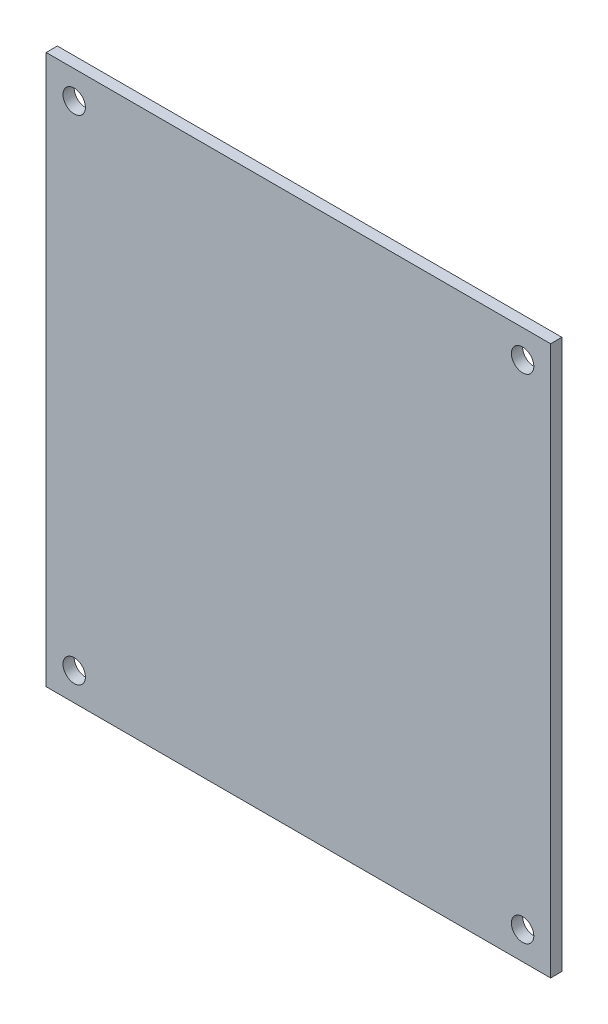
ISO-10303-21;
HEADER;
FILE_DESCRIPTION(('STEP AP214'),'2;1');
FILE_NAME('part.step','',(''),(''),'','','');
FILE_SCHEMA(('AUTOMOTIVE_DESIGN { 1 0 10303 214 1 1 1 1 }'));
ENDSEC;
DATA;
#1=APPLICATION_CONTEXT('core data for automotive mechanical design processes');
#2=APPLICATION_PROTOCOL_DEFINITION('international standard','automotive_design',2000,#1);
#3=PRODUCT_CONTEXT('',#1,'mechanical');
#4=PRODUCT('Part','Part','',(#3));
#5=PRODUCT_RELATED_PRODUCT_CATEGORY('part','',(#4));
#6=PRODUCT_DEFINITION_FORMATION('','',#4);
#7=PRODUCT_DEFINITION_CONTEXT('part definition',#1,'design');
#8=PRODUCT_DEFINITION('design','',#6,#7);
#9=PRODUCT_DEFINITION_SHAPE('','',#8);
#10=(LENGTH_UNIT() NAMED_UNIT(*) SI_UNIT(.MILLI.,.METRE.));
#11=(NAMED_UNIT(*) PLANE_ANGLE_UNIT() SI_UNIT($,.RADIAN.));
#12=(NAMED_UNIT(*) SI_UNIT($,.STERADIAN.) SOLID_ANGLE_UNIT());
#13=UNCERTAINTY_MEASURE_WITH_UNIT(LENGTH_MEASURE(1.E-05),#10,'distance_accuracy_value','');
#14=(GEOMETRIC_REPRESENTATION_CONTEXT(3) GLOBAL_UNCERTAINTY_ASSIGNED_CONTEXT((#13)) GLOBAL_UNIT_ASSIGNED_CONTEXT((#10,
#11,#12)) REPRESENTATION_CONTEXT('',''));
#15=CARTESIAN_POINT('',(0.,0.,0.));
#16=DIRECTION('',(0.,0.,1.));
#17=DIRECTION('',(1.,0.,0.));
#18=AXIS2_PLACEMENT_3D('',#15,#16,#17);
#19=CARTESIAN_POINT('',(-67.5,73.5,3.));
#20=DIRECTION('',(1.,0.,0.));
#21=DIRECTION('',(0.,1.,0.));
#22=AXIS2_PLACEMENT_3D('',#19,#20,#21);
#23=PLANE('',#22);
#24=DIRECTION('',(0.,-1.,0.));
#25=VECTOR('',#24,1.);
#26=CARTESIAN_POINT('',(-67.5,73.5,0.));
#27=LINE('',#26,#25);
#28=CARTESIAN_POINT('',(-67.5,73.5,0.));
#29=VERTEX_POINT('',#28);
#30=CARTESIAN_POINT('',(-67.5,-73.5,0.));
#31=VERTEX_POINT('',#30);
#32=EDGE_CURVE('E97',#29,#31,#27,.T.);
#33=ORIENTED_EDGE('',*,*,#32,.T.);
#34=DIRECTION('',(0.,0.,-1.));
#35=VECTOR('',#34,1.);
#36=CARTESIAN_POINT('',(-67.5,-73.5,3.));
#37=LINE('',#36,#35);
#38=CARTESIAN_POINT('',(-67.5,-73.5,3.));
#39=VERTEX_POINT('',#38);
#40=EDGE_CURVE('E11',#39,#31,#37,.T.);
#41=ORIENTED_EDGE('',*,*,#40,.F.);
#42=DIRECTION('',(0.,-1.,0.));
#43=VECTOR('',#42,1.);
#44=CARTESIAN_POINT('',(-67.5,73.5,3.));
#45=LINE('',#44,#43);
#46=CARTESIAN_POINT('',(-67.5,73.5,3.));
#47=VERTEX_POINT('',#46);
#48=EDGE_CURVE('E85',#47,#39,#45,.T.);
#49=ORIENTED_EDGE('',*,*,#48,.F.);
#50=DIRECTION('',(0.,0.,-1.));
#51=VECTOR('',#50,1.);
#52=CARTESIAN_POINT('',(-67.5,73.5,3.));
#53=LINE('',#52,#51);
#54=EDGE_CURVE('E93',#47,#29,#53,.T.);
#55=ORIENTED_EDGE('',*,*,#54,.T.);
#56=EDGE_LOOP('',(#33,#41,#49,#55));
#57=FACE_BOUND('',#56,.T.);
#58=ADVANCED_FACE('F34',(#57),#23,.F.);
#59=CARTESIAN_POINT('',(-67.5,-73.5,3.));
#60=DIRECTION('',(0.,1.,0.));
#61=DIRECTION('',(0.,0.,1.));
#62=AXIS2_PLACEMENT_3D('',#59,#60,#61);
#63=PLANE('',#62);
#64=DIRECTION('',(1.,0.,0.));
#65=VECTOR('',#64,1.);
#66=CARTESIAN_POINT('',(-67.5,-73.5,0.));
#67=LINE('',#66,#65);
#68=CARTESIAN_POINT('',(67.5,-73.5,0.));
#69=VERTEX_POINT('',#68);
#70=EDGE_CURVE('E89',#31,#69,#67,.T.);
#71=ORIENTED_EDGE('',*,*,#70,.T.);
#72=DIRECTION('',(0.,0.,-1.));
#73=VECTOR('',#72,1.);
#74=CARTESIAN_POINT('',(67.5,-73.5,3.));
#75=LINE('',#74,#73);
#76=CARTESIAN_POINT('',(67.5,-73.5,3.));
#77=VERTEX_POINT('',#76);
#78=EDGE_CURVE('E42',#77,#69,#75,.T.);
#79=ORIENTED_EDGE('',*,*,#78,.F.);
#80=DIRECTION('',(1.,0.,0.));
#81=VECTOR('',#80,1.);
#82=CARTESIAN_POINT('',(-67.5,-73.5,3.));
#83=LINE('',#82,#81);
#84=EDGE_CURVE('E80',#39,#77,#83,.T.);
#85=ORIENTED_EDGE('',*,*,#84,.F.);
#86=ORIENTED_EDGE('',*,*,#40,.T.);
#87=EDGE_LOOP('',(#71,#79,#85,#86));
#88=FACE_BOUND('',#87,.T.);
#89=ADVANCED_FACE('F88',(#88),#63,.F.);
#90=CARTESIAN_POINT('',(67.5,73.5,3.));
#91=DIRECTION('',(-1.,0.,0.));
#92=DIRECTION('',(0.,-1.,0.));
#93=AXIS2_PLACEMENT_3D('',#90,#91,#92);
#94=PLANE('',#93);
#95=DIRECTION('',(0.,1.,0.));
#96=VECTOR('',#95,1.);
#97=CARTESIAN_POINT('',(67.5,73.5,0.));
#98=LINE('',#97,#96);
#99=CARTESIAN_POINT('',(67.5,73.5,0.));
#100=VERTEX_POINT('',#99);
#101=EDGE_CURVE('E67',#69,#100,#98,.T.);
#102=ORIENTED_EDGE('',*,*,#101,.T.);
#103=DIRECTION('',(0.,0.,-1.));
#104=VECTOR('',#103,1.);
#105=CARTESIAN_POINT('',(67.5,73.5,3.));
#106=LINE('',#105,#104);
#107=CARTESIAN_POINT('',(67.5,73.5,3.));
#108=VERTEX_POINT('',#107);
#109=EDGE_CURVE('E90',#108,#100,#106,.T.);
#110=ORIENTED_EDGE('',*,*,#109,.F.);
#111=DIRECTION('',(0.,1.,0.));
#112=VECTOR('',#111,1.);
#113=CARTESIAN_POINT('',(67.5,73.5,3.));
#114=LINE('',#113,#112);
#115=EDGE_CURVE('E83',#77,#108,#114,.T.);
#116=ORIENTED_EDGE('',*,*,#115,.F.);
#117=ORIENTED_EDGE('',*,*,#78,.T.);
#118=EDGE_LOOP('',(#102,#110,#116,#117));
#119=FACE_BOUND('',#118,.T.);
#120=ADVANCED_FACE('F91',(#119),#94,.F.);
#121=CARTESIAN_POINT('',(-67.5,73.5,3.));
#122=DIRECTION('',(0.,-1.,0.));
#123=DIRECTION('',(0.,0.,-1.));
#124=AXIS2_PLACEMENT_3D('',#121,#122,#123);
#125=PLANE('',#124);
#126=DIRECTION('',(-1.,0.,0.));
#127=VECTOR('',#126,1.);
#128=CARTESIAN_POINT('',(-67.5,73.5,0.));
#129=LINE('',#128,#127);
#130=EDGE_CURVE('E73',#100,#29,#129,.T.);
#131=ORIENTED_EDGE('',*,*,#130,.T.);
#132=ORIENTED_EDGE('',*,*,#54,.F.);
#133=DIRECTION('',(-1.,0.,0.));
#134=VECTOR('',#133,1.);
#135=CARTESIAN_POINT('',(-67.5,73.5,3.));
#136=LINE('',#135,#134);
#137=EDGE_CURVE('E50',#108,#47,#136,.T.);
#138=ORIENTED_EDGE('',*,*,#137,.F.);
#139=ORIENTED_EDGE('',*,*,#109,.T.);
#140=EDGE_LOOP('',(#131,#132,#138,#139));
#141=FACE_BOUND('',#140,.T.);
#142=ADVANCED_FACE('F105',(#141),#125,.F.);
#143=CARTESIAN_POINT('',(0.,0.,3.));
#144=DIRECTION('',(0.,0.,1.));
#145=DIRECTION('',(1.,0.,0.));
#146=AXIS2_PLACEMENT_3D('',#143,#144,#145);
#147=PLANE('',#146);
#148=CARTESIAN_POINT('',(60.0000000000001,-66.,3.));
#149=DIRECTION('',(0.,0.,1.));
#150=DIRECTION('',(1.,0.,0.));
#151=AXIS2_PLACEMENT_3D('',#148,#149,#150);
#152=CIRCLE('',#151,3.);
#153=CARTESIAN_POINT('',(63.0000000000001,-66.,3.));
#154=VERTEX_POINT('',#153);
#155=EDGE_CURVE('E131',#154,#154,#152,.T.);
#156=ORIENTED_EDGE('',*,*,#155,.F.);
#157=EDGE_LOOP('',(#156));
#158=FACE_BOUND('',#157,.T.);
#159=CARTESIAN_POINT('',(-60.,-66.,3.));
#160=DIRECTION('',(0.,0.,1.));
#161=DIRECTION('',(1.,0.,0.));
#162=AXIS2_PLACEMENT_3D('',#159,#160,#161);
#163=CIRCLE('',#162,3.);
#164=CARTESIAN_POINT('',(-57.,-66.,3.));
#165=VERTEX_POINT('',#164);
#166=EDGE_CURVE('E125',#165,#165,#163,.T.);
#167=ORIENTED_EDGE('',*,*,#166,.F.);
#168=EDGE_LOOP('',(#167));
#169=FACE_BOUND('',#168,.T.);
#170=CARTESIAN_POINT('',(-59.9999999999999,66.,3.));
#171=DIRECTION('',(0.,0.,1.));
#172=DIRECTION('',(1.,0.,0.));
#173=AXIS2_PLACEMENT_3D('',#170,#171,#172);
#174=CIRCLE('',#173,3.);
#175=CARTESIAN_POINT('',(-56.9999999999999,66.,3.));
#176=VERTEX_POINT('',#175);
#177=EDGE_CURVE('E119',#176,#176,#174,.T.);
#178=ORIENTED_EDGE('',*,*,#177,.F.);
#179=EDGE_LOOP('',(#178));
#180=FACE_BOUND('',#179,.T.);
#181=CARTESIAN_POINT('',(60.0000000000001,66.,3.));
#182=DIRECTION('',(0.,0.,1.));
#183=DIRECTION('',(1.,0.,0.));
#184=AXIS2_PLACEMENT_3D('',#181,#182,#183);
#185=CIRCLE('',#184,3.);
#186=CARTESIAN_POINT('',(63.0000000000001,66.,3.));
#187=VERTEX_POINT('',#186);
#188=EDGE_CURVE('E113',#187,#187,#185,.T.);
#189=ORIENTED_EDGE('',*,*,#188,.F.);
#190=EDGE_LOOP('',(#189));
#191=FACE_BOUND('',#190,.T.);
#192=ORIENTED_EDGE('',*,*,#48,.T.);
#193=ORIENTED_EDGE('',*,*,#84,.T.);
#194=ORIENTED_EDGE('',*,*,#115,.T.);
#195=ORIENTED_EDGE('',*,*,#137,.T.);
#196=EDGE_LOOP('',(#192,#193,#194,#195));
#197=FACE_BOUND('',#196,.T.);
#198=ADVANCED_FACE('F81',(#158,#169,#180,#191,#197),#147,.T.);
#199=CARTESIAN_POINT('',(0.,0.,0.));
#200=DIRECTION('',(0.,0.,1.));
#201=DIRECTION('',(1.,0.,0.));
#202=AXIS2_PLACEMENT_3D('',#199,#200,#201);
#203=PLANE('',#202);
#204=CARTESIAN_POINT('',(60.0000000000001,-66.,0.));
#205=DIRECTION('',(0.,0.,1.));
#206=DIRECTION('',(1.,0.,0.));
#207=AXIS2_PLACEMENT_3D('',#204,#205,#206);
#208=CIRCLE('',#207,3.);
#209=CARTESIAN_POINT('',(63.0000000000001,-66.,0.));
#210=VERTEX_POINT('',#209);
#211=EDGE_CURVE('E128',#210,#210,#208,.T.);
#212=ORIENTED_EDGE('',*,*,#211,.T.);
#213=EDGE_LOOP('',(#212));
#214=FACE_BOUND('',#213,.T.);
#215=CARTESIAN_POINT('',(-60.,-66.,0.));
#216=DIRECTION('',(0.,0.,1.));
#217=DIRECTION('',(1.,0.,0.));
#218=AXIS2_PLACEMENT_3D('',#215,#216,#217);
#219=CIRCLE('',#218,3.);
#220=CARTESIAN_POINT('',(-57.,-66.,0.));
#221=VERTEX_POINT('',#220);
#222=EDGE_CURVE('E122',#221,#221,#219,.T.);
#223=ORIENTED_EDGE('',*,*,#222,.T.);
#224=EDGE_LOOP('',(#223));
#225=FACE_BOUND('',#224,.T.);
#226=CARTESIAN_POINT('',(-59.9999999999999,66.,0.));
#227=DIRECTION('',(0.,0.,1.));
#228=DIRECTION('',(1.,0.,0.));
#229=AXIS2_PLACEMENT_3D('',#226,#227,#228);
#230=CIRCLE('',#229,3.);
#231=CARTESIAN_POINT('',(-56.9999999999999,66.,0.));
#232=VERTEX_POINT('',#231);
#233=EDGE_CURVE('E116',#232,#232,#230,.T.);
#234=ORIENTED_EDGE('',*,*,#233,.T.);
#235=EDGE_LOOP('',(#234));
#236=FACE_BOUND('',#235,.T.);
#237=CARTESIAN_POINT('',(60.0000000000001,66.,0.));
#238=DIRECTION('',(0.,0.,1.));
#239=DIRECTION('',(1.,0.,0.));
#240=AXIS2_PLACEMENT_3D('',#237,#238,#239);
#241=CIRCLE('',#240,3.);
#242=CARTESIAN_POINT('',(63.0000000000001,66.,0.));
#243=VERTEX_POINT('',#242);
#244=EDGE_CURVE('E100',#243,#243,#241,.T.);
#245=ORIENTED_EDGE('',*,*,#244,.T.);
#246=EDGE_LOOP('',(#245));
#247=FACE_BOUND('',#246,.T.);
#248=ORIENTED_EDGE('',*,*,#32,.F.);
#249=ORIENTED_EDGE('',*,*,#130,.F.);
#250=ORIENTED_EDGE('',*,*,#101,.F.);
#251=ORIENTED_EDGE('',*,*,#70,.F.);
#252=EDGE_LOOP('',(#248,#249,#250,#251));
#253=FACE_BOUND('',#252,.T.);
#254=ADVANCED_FACE('F108',(#214,#225,#236,#247,#253),#203,.F.);
#255=CARTESIAN_POINT('',(60.0000000000001,66.,3.));
#256=DIRECTION('',(0.,0.,1.));
#257=DIRECTION('',(1.,0.,0.));
#258=AXIS2_PLACEMENT_3D('',#255,#256,#257);
#259=CYLINDRICAL_SURFACE('',#258,3.);
#260=ORIENTED_EDGE('',*,*,#244,.F.);
#261=EDGE_LOOP('',(#260));
#262=FACE_BOUND('',#261,.T.);
#263=ORIENTED_EDGE('',*,*,#188,.T.);
#264=EDGE_LOOP('',(#263));
#265=FACE_BOUND('',#264,.T.);
#266=ADVANCED_FACE('F146',(#262,#265),#259,.F.);
#267=CARTESIAN_POINT('',(-59.9999999999999,66.,3.));
#268=DIRECTION('',(0.,0.,1.));
#269=DIRECTION('',(1.,0.,0.));
#270=AXIS2_PLACEMENT_3D('',#267,#268,#269);
#271=CYLINDRICAL_SURFACE('',#270,3.);
#272=ORIENTED_EDGE('',*,*,#233,.F.);
#273=EDGE_LOOP('',(#272));
#274=FACE_BOUND('',#273,.T.);
#275=ORIENTED_EDGE('',*,*,#177,.T.);
#276=EDGE_LOOP('',(#275));
#277=FACE_BOUND('',#276,.T.);
#278=ADVANCED_FACE('F148',(#274,#277),#271,.F.);
#279=CARTESIAN_POINT('',(-60.,-66.,3.));
#280=DIRECTION('',(0.,0.,1.));
#281=DIRECTION('',(1.,0.,0.));
#282=AXIS2_PLACEMENT_3D('',#279,#280,#281);
#283=CYLINDRICAL_SURFACE('',#282,3.);
#284=ORIENTED_EDGE('',*,*,#222,.F.);
#285=EDGE_LOOP('',(#284));
#286=FACE_BOUND('',#285,.T.);
#287=ORIENTED_EDGE('',*,*,#166,.T.);
#288=EDGE_LOOP('',(#287));
#289=FACE_BOUND('',#288,.T.);
#290=ADVANCED_FACE('F155',(#286,#289),#283,.F.);
#291=CARTESIAN_POINT('',(60.0000000000001,-66.,3.));
#292=DIRECTION('',(0.,0.,1.));
#293=DIRECTION('',(1.,0.,0.));
#294=AXIS2_PLACEMENT_3D('',#291,#292,#293);
#295=CYLINDRICAL_SURFACE('',#294,3.);
#296=ORIENTED_EDGE('',*,*,#211,.F.);
#297=EDGE_LOOP('',(#296));
#298=FACE_BOUND('',#297,.T.);
#299=ORIENTED_EDGE('',*,*,#155,.T.);
#300=EDGE_LOOP('',(#299));
#301=FACE_BOUND('',#300,.T.);
#302=ADVANCED_FACE('F135',(#298,#301),#295,.F.);
#303=CLOSED_SHELL('',(#58,#89,#120,#142,#198,#254,#266,#278,#290,#302));
#304=MANIFOLD_SOLID_BREP('B2',#303);
#305=ADVANCED_BREP_SHAPE_REPRESENTATION('',(#18,#304),#14);
#306=SHAPE_DEFINITION_REPRESENTATION(#9,#305);
ENDSEC;
END-ISO-10303-21;
